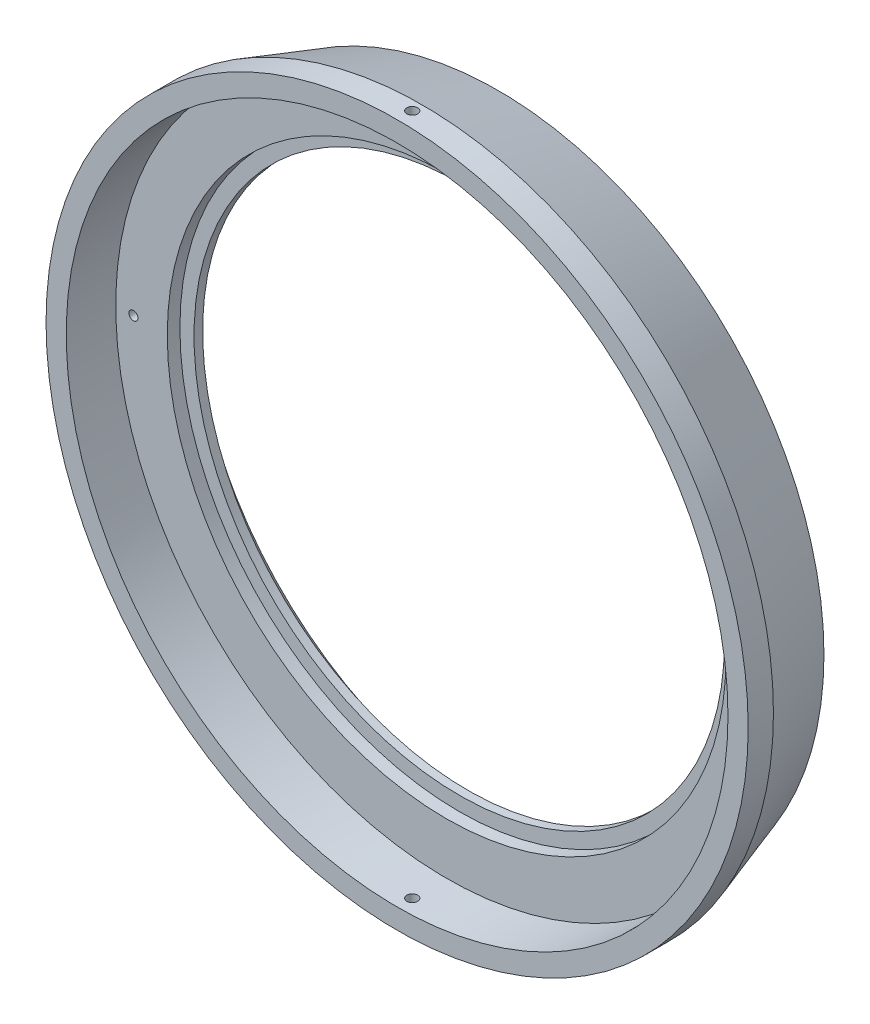
ISO-10303-21;
HEADER;
FILE_DESCRIPTION(('STEP AP214'),'2;1');
FILE_NAME('part.step','',(''),(''),'','','');
FILE_SCHEMA(('AUTOMOTIVE_DESIGN { 1 0 10303 214 1 1 1 1 }'));
ENDSEC;
DATA;
#1=APPLICATION_CONTEXT('core data for automotive mechanical design processes');
#2=APPLICATION_PROTOCOL_DEFINITION('international standard','automotive_design',2000,#1);
#3=PRODUCT_CONTEXT('',#1,'mechanical');
#4=PRODUCT('Part','Part','',(#3));
#5=PRODUCT_RELATED_PRODUCT_CATEGORY('part','',(#4));
#6=PRODUCT_DEFINITION_FORMATION('','',#4);
#7=PRODUCT_DEFINITION_CONTEXT('part definition',#1,'design');
#8=PRODUCT_DEFINITION('design','',#6,#7);
#9=PRODUCT_DEFINITION_SHAPE('','',#8);
#10=(LENGTH_UNIT() NAMED_UNIT(*) SI_UNIT(.MILLI.,.METRE.));
#11=(NAMED_UNIT(*) PLANE_ANGLE_UNIT() SI_UNIT($,.RADIAN.));
#12=(NAMED_UNIT(*) SI_UNIT($,.STERADIAN.) SOLID_ANGLE_UNIT());
#13=UNCERTAINTY_MEASURE_WITH_UNIT(LENGTH_MEASURE(1.E-05),#10,'distance_accuracy_value','');
#14=(GEOMETRIC_REPRESENTATION_CONTEXT(3) GLOBAL_UNCERTAINTY_ASSIGNED_CONTEXT((#13)) GLOBAL_UNIT_ASSIGNED_CONTEXT((#10,
#11,#12)) REPRESENTATION_CONTEXT('',''));
#15=CARTESIAN_POINT('',(0.,0.,0.));
#16=DIRECTION('',(0.,0.,1.));
#17=DIRECTION('',(1.,0.,0.));
#18=AXIS2_PLACEMENT_3D('',#15,#16,#17);
#19=CARTESIAN_POINT('',(0.,0.,25.4));
#20=DIRECTION('',(0.,0.,-1.));
#21=DIRECTION('',(-1.,0.,0.));
#22=AXIS2_PLACEMENT_3D('',#19,#20,#21);
#23=CYLINDRICAL_SURFACE('',#22,88.265);
#24=CARTESIAN_POINT('',(0.,-88.265,22.94255));
#25=CARTESIAN_POINT('',(0.0759685424256277,-88.264999859988,22.9425466326268));
#26=CARTESIAN_POINT('',(0.151992055687485,-88.2649008694297,22.936128145498));
#27=CARTESIAN_POINT('',(0.301945026810555,-88.2645154927316,22.9106127790071));
#28=CARTESIAN_POINT('',(0.375871857780507,-88.2642288814856,22.8915006695043));
#29=CARTESIAN_POINT('',(0.519437343409552,-88.263500729006,22.841142558233));
#30=CARTESIAN_POINT('',(0.589078040606503,-88.2630592622508,22.8099023887267));
#31=CARTESIAN_POINT('',(0.722106798009332,-88.2620712271952,22.736183055391));
#32=CARTESIAN_POINT('',(0.785496400246483,-88.2615246849136,22.6937066728994));
#33=CARTESIAN_POINT('',(0.904257603167196,-88.2603879248538,22.5987083947465));
#34=CARTESIAN_POINT('',(0.95962777485974,-88.2597976993198,22.5461847126063));
#35=CARTESIAN_POINT('',(1.06076666124008,-88.2586401657667,22.4325849593066));
#36=CARTESIAN_POINT('',(1.10653499748662,-88.2580728586517,22.3715085512129));
#37=CARTESIAN_POINT('',(1.18716976909093,-88.2570251314188,22.2425362367148));
#38=CARTESIAN_POINT('',(1.2220358713234,-88.2565447139561,22.1746401220132));
#39=CARTESIAN_POINT('',(1.27987406632831,-88.2557249634532,22.0339573084132));
#40=CARTESIAN_POINT('',(1.30284618921664,-88.2553856300558,21.9611706218984));
#41=CARTESIAN_POINT('',(1.33624269833971,-88.2548863368842,21.812778747671));
#42=CARTESIAN_POINT('',(1.3466680595793,-88.2547263631722,21.737173779437));
#43=CARTESIAN_POINT('',(1.35467809210785,-88.2546037839277,21.5852866668808));
#44=CARTESIAN_POINT('',(1.35226279386922,-88.2546411779268,21.509004524166));
#45=CARTESIAN_POINT('',(1.33466094834983,-88.2549091042145,21.3579350766472));
#46=CARTESIAN_POINT('',(1.31947546983167,-88.2551396203402,21.2831476472837));
#47=CARTESIAN_POINT('',(1.27676596791952,-88.2557677774888,21.1371837362106));
#48=CARTESIAN_POINT('',(1.2492419278061,-88.2561654187381,21.0660072593941));
#49=CARTESIAN_POINT('',(1.1826353964172,-88.2570830151386,20.9292823583018));
#50=CARTESIAN_POINT('',(1.14355241527837,-88.2576029754735,20.8637341727028));
#51=CARTESIAN_POINT('',(1.05493782373318,-88.2587065845068,20.7401291964904));
#52=CARTESIAN_POINT('',(1.00540621022067,-88.2592902332242,20.6820724081041));
#53=CARTESIAN_POINT('',(0.897294317351466,-88.2604554914424,20.5750920002664));
#54=CARTESIAN_POINT('',(0.838713107003588,-88.261037100727,20.5261693216456));
#55=CARTESIAN_POINT('',(0.714168240935099,-88.2621326519208,20.438853132368));
#56=CARTESIAN_POINT('',(0.648204584197212,-88.2626465938207,20.4004596231622));
#57=CARTESIAN_POINT('',(0.510766823404227,-88.263548870978,20.3352917629766));
#58=CARTESIAN_POINT('',(0.439292706137229,-88.2639372059342,20.308517439856));
#59=CARTESIAN_POINT('',(0.292863183973475,-88.2645444839995,20.2673485846012));
#60=CARTESIAN_POINT('',(0.217907781664492,-88.2647634272344,20.2529540432647));
#61=CARTESIAN_POINT('',(0.0666516081899811,-88.2650072233672,20.2369545152216));
#62=CARTESIAN_POINT('',(-0.00964902535308479,-88.2650320960051,20.2353482277483));
#63=CARTESIAN_POINT('',(-0.161436899437708,-88.2648849991048,20.2449674173061));
#64=CARTESIAN_POINT('',(-0.236924140197854,-88.2647130296196,20.2561928908888));
#65=CARTESIAN_POINT('',(-0.384938762063575,-88.2641916475764,20.2911558711378));
#66=CARTESIAN_POINT('',(-0.457466282293365,-88.2638422433693,20.3148927889612));
#67=CARTESIAN_POINT('',(-0.597506892359322,-88.2630053793142,20.3742042400736));
#68=CARTESIAN_POINT('',(-0.665019980042248,-88.2625179194067,20.4097787784456));
#69=CARTESIAN_POINT('',(-0.793121234108174,-88.2614598405584,20.4917589748552));
#70=CARTESIAN_POINT('',(-0.853708839940509,-88.2608892148945,20.5381655087144));
#71=CARTESIAN_POINT('',(-0.96623362866124,-88.2597291542212,20.6404910872243));
#72=CARTESIAN_POINT('',(-1.01817080320656,-88.2591397191936,20.6964101410495));
#73=CARTESIAN_POINT('',(-1.11192471376652,-88.2580084367001,20.8161789621977));
#74=CARTESIAN_POINT('',(-1.15374060910162,-88.2574665931896,20.8800293876391));
#75=CARTESIAN_POINT('',(-1.22605916398515,-88.256491645378,21.0138450158439));
#76=CARTESIAN_POINT('',(-1.25656183902144,-88.256058540928,21.0838102102359));
#77=CARTESIAN_POINT('',(-1.30538664472826,-88.2553499287974,21.2278661308531));
#78=CARTESIAN_POINT('',(-1.32370932440448,-88.2550744140137,21.3019566709676));
#79=CARTESIAN_POINT('',(-1.34765583498588,-88.2547120234361,21.4521628350023));
#80=CARTESIAN_POINT('',(-1.35327965188023,-88.2546251478504,21.5282784611567));
#81=CARTESIAN_POINT('',(-1.3516686900966,-88.2546498335717,21.680365513743));
#82=CARTESIAN_POINT('',(-1.34443525188035,-88.2547613741923,21.7563369543806));
#83=CARTESIAN_POINT('',(-1.31731783571436,-88.2551702741662,21.9059871178779));
#84=CARTESIAN_POINT('',(-1.29743383240739,-88.255467633892,21.9796658361416));
#85=CARTESIAN_POINT('',(-1.2455795671077,-88.2562146504535,22.12264043614));
#86=CARTESIAN_POINT('',(-1.2136090832734,-88.2566643100847,22.1919362374011));
#87=CARTESIAN_POINT('',(-1.13849085649738,-88.2576652098828,22.3241744927953));
#88=CARTESIAN_POINT('',(-1.09534354337347,-88.2582164461432,22.3871171911149));
#89=CARTESIAN_POINT('',(-0.999096374489048,-88.2593583769619,22.504866290249));
#90=CARTESIAN_POINT('',(-0.945996540319697,-88.2599490714346,22.5596727087139));
#91=CARTESIAN_POINT('',(-0.831333921919023,-88.2611034872464,22.6596071734711));
#92=CARTESIAN_POINT('',(-0.769769039586007,-88.2616672018515,22.7047328132159));
#93=CARTESIAN_POINT('',(-0.639909747931443,-88.2627042195314,22.7840269686425));
#94=CARTESIAN_POINT('',(-0.571611843815412,-88.2631774752748,22.818189754462));
#95=CARTESIAN_POINT('',(-0.430302558045668,-88.2639792671995,22.8745246273715));
#96=CARTESIAN_POINT('',(-0.357296937134505,-88.2643079765459,22.8967110692934));
#97=CARTESIAN_POINT('',(-0.236522591380123,-88.2646954089289,22.9225590327191));
#98=CARTESIAN_POINT('',(-0.18953841680852,-88.2648091376093,22.9300462695273));
#99=CARTESIAN_POINT('',(-0.0950433348390116,-88.2649614769438,22.9400428064383));
#100=CARTESIAN_POINT('',(-0.0475324274808863,-88.2650000876035,22.9425521069171));
#101=CARTESIAN_POINT('',(0.,-88.265,22.94255));
#102=B_SPLINE_CURVE_WITH_KNOTS('',3,(#24,#25,#26,#27,#28,#29,#30,#31,#32,#33,#34,#35,#36,#37,
#38,#39,#40,#41,#42,#43,#44,#45,#46,#47,#48,#49,#50,#51,#52,#53,#54,#55,#56,#57,#58,#59,#60,#61,
#62,#63,#64,#65,#66,#67,#68,#69,#70,#71,#72,#73,#74,#75,#76,#77,#78,#79,#80,#81,#82,#83,#84,#85,
#86,#87,#88,#89,#90,#91,#92,#93,#94,#95,#96,#97,#98,#99,#100,#101),.UNSPECIFIED.,.T.,.F.,(4,2,2,
2,2,2,2,2,2,2,2,2,2,2,2,2,2,2,2,2,2,2,2,2,2,2,2,2,2,2,2,2,2,2,2,2,2,2,4),(0.,0.227732132408335,
0.45573799859902,0.683634354609526,0.911474351368111,1.1393548973641,1.36724442322685,
1.59514091173121,1.82303682319257,2.05091502379153,2.27879268360878,2.50665127377486,
2.73451017270323,2.96237872958591,3.19024735420891,3.4181394367977,3.64603155078926,
3.87392421119277,4.10181670219768,4.32968601265164,4.55755526186684,4.78541378752438,
5.0132724110258,5.2411494644353,5.46902673762386,5.69692293194536,5.92481881427428,
6.15270442364159,6.38059028443786,6.60845238788032,6.83631494805892,7.06418169074904,
7.29203967186277,7.51989715866358,7.74781122315226,7.9758442162736,8.20360327897999,
8.34609201893277,8.48858074812438),.UNSPECIFIED.);
#103=CARTESIAN_POINT('',(0.,-88.265,22.94255));
#104=VERTEX_POINT('',#103);
#105=EDGE_CURVE('E96',#104,#104,#102,.T.);
#106=ORIENTED_EDGE('',*,*,#105,.T.);
#107=EDGE_LOOP('',(#106));
#108=FACE_BOUND('',#107,.T.);
#109=CARTESIAN_POINT('',(0.,88.265,22.94255));
#110=CARTESIAN_POINT('',(-0.0759685424256277,88.264999859988,22.9425466326268));
#111=CARTESIAN_POINT('',(-0.151992055687485,88.2649008694297,22.936128145498));
#112=CARTESIAN_POINT('',(-0.301945026810555,88.2645154927316,22.9106127790071));
#113=CARTESIAN_POINT('',(-0.375871857780507,88.2642288814856,22.8915006695043));
#114=CARTESIAN_POINT('',(-0.519437343409552,88.263500729006,22.841142558233));
#115=CARTESIAN_POINT('',(-0.589078040606503,88.2630592622508,22.8099023887267));
#116=CARTESIAN_POINT('',(-0.722106798009332,88.2620712271952,22.736183055391));
#117=CARTESIAN_POINT('',(-0.785496400246483,88.2615246849136,22.6937066728994));
#118=CARTESIAN_POINT('',(-0.904257603167196,88.2603879248538,22.5987083947465));
#119=CARTESIAN_POINT('',(-0.95962777485974,88.2597976993198,22.5461847126063));
#120=CARTESIAN_POINT('',(-1.06076666124008,88.2586401657667,22.4325849593066));
#121=CARTESIAN_POINT('',(-1.10653499748662,88.2580728586517,22.3715085512129));
#122=CARTESIAN_POINT('',(-1.18716976909093,88.2570251314188,22.2425362367148));
#123=CARTESIAN_POINT('',(-1.2220358713234,88.2565447139561,22.1746401220132));
#124=CARTESIAN_POINT('',(-1.27987406632831,88.2557249634532,22.0339573084132));
#125=CARTESIAN_POINT('',(-1.30284618921664,88.2553856300558,21.9611706218984));
#126=CARTESIAN_POINT('',(-1.33624269833971,88.2548863368842,21.812778747671));
#127=CARTESIAN_POINT('',(-1.3466680595793,88.2547263631722,21.737173779437));
#128=CARTESIAN_POINT('',(-1.35467809210785,88.2546037839277,21.5852866668808));
#129=CARTESIAN_POINT('',(-1.35226279386922,88.2546411779268,21.509004524166));
#130=CARTESIAN_POINT('',(-1.33466094834983,88.2549091042145,21.3579350766472));
#131=CARTESIAN_POINT('',(-1.31947546983167,88.2551396203402,21.2831476472837));
#132=CARTESIAN_POINT('',(-1.27676596791952,88.2557677774888,21.1371837362106));
#133=CARTESIAN_POINT('',(-1.2492419278061,88.2561654187381,21.0660072593941));
#134=CARTESIAN_POINT('',(-1.1826353964172,88.2570830151386,20.9292823583018));
#135=CARTESIAN_POINT('',(-1.14355241527837,88.2576029754735,20.8637341727028));
#136=CARTESIAN_POINT('',(-1.05493782373318,88.2587065845068,20.7401291964904));
#137=CARTESIAN_POINT('',(-1.00540621022067,88.2592902332242,20.6820724081041));
#138=CARTESIAN_POINT('',(-0.897294317351466,88.2604554914424,20.5750920002664));
#139=CARTESIAN_POINT('',(-0.838713107003588,88.261037100727,20.5261693216456));
#140=CARTESIAN_POINT('',(-0.714168240935099,88.2621326519208,20.438853132368));
#141=CARTESIAN_POINT('',(-0.648204584197212,88.2626465938207,20.4004596231622));
#142=CARTESIAN_POINT('',(-0.510766823404227,88.263548870978,20.3352917629766));
#143=CARTESIAN_POINT('',(-0.439292706137229,88.2639372059342,20.308517439856));
#144=CARTESIAN_POINT('',(-0.292863183973475,88.2645444839995,20.2673485846012));
#145=CARTESIAN_POINT('',(-0.217907781664492,88.2647634272344,20.2529540432647));
#146=CARTESIAN_POINT('',(-0.0666516081899811,88.2650072233672,20.2369545152216));
#147=CARTESIAN_POINT('',(0.00964902535308479,88.2650320960051,20.2353482277483));
#148=CARTESIAN_POINT('',(0.161436899437708,88.2648849991048,20.2449674173061));
#149=CARTESIAN_POINT('',(0.236924140197854,88.2647130296196,20.2561928908888));
#150=CARTESIAN_POINT('',(0.384938762063575,88.2641916475764,20.2911558711378));
#151=CARTESIAN_POINT('',(0.457466282293365,88.2638422433693,20.3148927889612));
#152=CARTESIAN_POINT('',(0.597506892359322,88.2630053793142,20.3742042400736));
#153=CARTESIAN_POINT('',(0.665019980042248,88.2625179194067,20.4097787784456));
#154=CARTESIAN_POINT('',(0.793121234108174,88.2614598405584,20.4917589748552));
#155=CARTESIAN_POINT('',(0.853708839940509,88.2608892148945,20.5381655087144));
#156=CARTESIAN_POINT('',(0.96623362866124,88.2597291542212,20.6404910872243));
#157=CARTESIAN_POINT('',(1.01817080320656,88.2591397191936,20.6964101410495));
#158=CARTESIAN_POINT('',(1.11192471376652,88.2580084367001,20.8161789621977));
#159=CARTESIAN_POINT('',(1.15374060910162,88.2574665931896,20.8800293876391));
#160=CARTESIAN_POINT('',(1.22605916398515,88.256491645378,21.0138450158439));
#161=CARTESIAN_POINT('',(1.25656183902144,88.256058540928,21.0838102102359));
#162=CARTESIAN_POINT('',(1.30538664472826,88.2553499287974,21.2278661308531));
#163=CARTESIAN_POINT('',(1.32370932440448,88.2550744140137,21.3019566709676));
#164=CARTESIAN_POINT('',(1.34765583498588,88.2547120234361,21.4521628350023));
#165=CARTESIAN_POINT('',(1.35327965188023,88.2546251478504,21.5282784611567));
#166=CARTESIAN_POINT('',(1.3516686900966,88.2546498335717,21.680365513743));
#167=CARTESIAN_POINT('',(1.34443525188035,88.2547613741923,21.7563369543806));
#168=CARTESIAN_POINT('',(1.31731783571436,88.2551702741662,21.9059871178779));
#169=CARTESIAN_POINT('',(1.29743383240739,88.255467633892,21.9796658361416));
#170=CARTESIAN_POINT('',(1.2455795671077,88.2562146504535,22.12264043614));
#171=CARTESIAN_POINT('',(1.2136090832734,88.2566643100847,22.1919362374011));
#172=CARTESIAN_POINT('',(1.13849085649738,88.2576652098828,22.3241744927953));
#173=CARTESIAN_POINT('',(1.09534354337347,88.2582164461432,22.3871171911149));
#174=CARTESIAN_POINT('',(0.999096374489048,88.2593583769619,22.504866290249));
#175=CARTESIAN_POINT('',(0.945996540319697,88.2599490714346,22.5596727087139));
#176=CARTESIAN_POINT('',(0.831333921919023,88.2611034872464,22.6596071734711));
#177=CARTESIAN_POINT('',(0.769769039586007,88.2616672018515,22.7047328132159));
#178=CARTESIAN_POINT('',(0.639909747931443,88.2627042195314,22.7840269686425));
#179=CARTESIAN_POINT('',(0.571611843815412,88.2631774752748,22.818189754462));
#180=CARTESIAN_POINT('',(0.430302558045668,88.2639792671995,22.8745246273715));
#181=CARTESIAN_POINT('',(0.357296937134505,88.2643079765459,22.8967110692934));
#182=CARTESIAN_POINT('',(0.236522591380123,88.2646954089289,22.9225590327191));
#183=CARTESIAN_POINT('',(0.18953841680852,88.2648091376093,22.9300462695273));
#184=CARTESIAN_POINT('',(0.0950433348390116,88.2649614769438,22.9400428064383));
#185=CARTESIAN_POINT('',(0.0475324274808863,88.2650000876035,22.9425521069171));
#186=CARTESIAN_POINT('',(0.,88.265,22.94255));
#187=B_SPLINE_CURVE_WITH_KNOTS('',3,(#109,#110,#111,#112,#113,#114,#115,#116,#117,#118,#119,
#120,#121,#122,#123,#124,#125,#126,#127,#128,#129,#130,#131,#132,#133,#134,#135,#136,#137,#138,
#139,#140,#141,#142,#143,#144,#145,#146,#147,#148,#149,#150,#151,#152,#153,#154,#155,#156,#157,
#158,#159,#160,#161,#162,#163,#164,#165,#166,#167,#168,#169,#170,#171,#172,#173,#174,#175,#176,
#177,#178,#179,#180,#181,#182,#183,#184,#185,#186),.UNSPECIFIED.,.T.,.F.,(4,2,2,2,2,2,2,2,2,2,2,
2,2,2,2,2,2,2,2,2,2,2,2,2,2,2,2,2,2,2,2,2,2,2,2,2,2,2,4),(0.,0.227732132408335,0.45573799859902,
0.683634354609526,0.911474351368111,1.1393548973641,1.36724442322685,1.59514091173121,
1.82303682319257,2.05091502379153,2.27879268360878,2.50665127377486,2.73451017270323,
2.96237872958591,3.19024735420891,3.4181394367977,3.64603155078926,3.87392421119277,
4.10181670219768,4.32968601265164,4.55755526186684,4.78541378752438,5.0132724110258,
5.2411494644353,5.46902673762386,5.69692293194536,5.92481881427428,6.15270442364159,
6.38059028443786,6.60845238788032,6.83631494805892,7.06418169074904,7.29203967186277,
7.51989715866358,7.74781122315226,7.9758442162736,8.20360327897999,8.34609201893277,
8.48858074812438),.UNSPECIFIED.);
#188=CARTESIAN_POINT('',(0.,88.265,22.94255));
#189=VERTEX_POINT('',#188);
#190=EDGE_CURVE('E88',#189,#189,#187,.T.);
#191=ORIENTED_EDGE('',*,*,#190,.T.);
#192=EDGE_LOOP('',(#191));
#193=FACE_BOUND('',#192,.T.);
#194=CARTESIAN_POINT('',(0.,0.,19.0500000000003));
#195=DIRECTION('',(0.,0.,1.));
#196=DIRECTION('',(1.,0.,0.));
#197=AXIS2_PLACEMENT_3D('',#194,#195,#196);
#198=CIRCLE('',#197,88.265);
#199=CARTESIAN_POINT('',(88.265,0.,19.0500000000003));
#200=VERTEX_POINT('',#199);
#201=EDGE_CURVE('E154',#200,#200,#198,.T.);
#202=ORIENTED_EDGE('',*,*,#201,.T.);
#203=EDGE_LOOP('',(#202));
#204=FACE_BOUND('',#203,.T.);
#205=CARTESIAN_POINT('',(0.,0.,25.4));
#206=DIRECTION('',(0.,0.,1.));
#207=DIRECTION('',(1.,0.,0.));
#208=AXIS2_PLACEMENT_3D('',#205,#206,#207);
#209=CIRCLE('',#208,88.265);
#210=CARTESIAN_POINT('',(88.265,0.,25.4));
#211=VERTEX_POINT('',#210);
#212=EDGE_CURVE('E157',#211,#211,#209,.T.);
#213=ORIENTED_EDGE('',*,*,#212,.F.);
#214=EDGE_LOOP('',(#213));
#215=FACE_BOUND('',#214,.T.);
#216=ADVANCED_FACE('F38',(#108,#193,#204,#215),#23,.T.);
#217=CARTESIAN_POINT('',(0.,0.,25.4));
#218=DIRECTION('',(0.,0.,1.));
#219=DIRECTION('',(1.,0.,0.));
#220=AXIS2_PLACEMENT_3D('',#217,#218,#219);
#221=PLANE('',#220);
#222=CARTESIAN_POINT('',(0.,0.,25.4));
#223=DIRECTION('',(0.,0.,1.));
#224=DIRECTION('',(1.,0.,0.));
#225=AXIS2_PLACEMENT_3D('',#222,#223,#224);
#226=CIRCLE('',#225,83.185);
#227=CARTESIAN_POINT('',(83.185,0.,25.4));
#228=VERTEX_POINT('',#227);
#229=EDGE_CURVE('E160',#228,#228,#226,.T.);
#230=ORIENTED_EDGE('',*,*,#229,.F.);
#231=EDGE_LOOP('',(#230));
#232=FACE_BOUND('',#231,.T.);
#233=ORIENTED_EDGE('',*,*,#212,.T.);
#234=EDGE_LOOP('',(#233));
#235=FACE_BOUND('',#234,.T.);
#236=ADVANCED_FACE('F132',(#232,#235),#221,.T.);
#237=CARTESIAN_POINT('',(0.,0.,0.));
#238=DIRECTION('',(0.,0.,1.));
#239=DIRECTION('',(1.,0.,0.));
#240=AXIS2_PLACEMENT_3D('',#237,#238,#239);
#241=PLANE('',#240);
#242=CARTESIAN_POINT('',(0.,0.,0.));
#243=DIRECTION('',(0.,0.,1.));
#244=DIRECTION('',(1.,0.,0.));
#245=AXIS2_PLACEMENT_3D('',#242,#243,#244);
#246=CIRCLE('',#245,76.8350000000001);
#247=CARTESIAN_POINT('',(76.8350000000001,0.,0.));
#248=VERTEX_POINT('',#247);
#249=EDGE_CURVE('E54',#248,#248,#246,.T.);
#250=ORIENTED_EDGE('',*,*,#249,.T.);
#251=EDGE_LOOP('',(#250));
#252=FACE_BOUND('',#251,.T.);
#253=CARTESIAN_POINT('',(0.,0.,0.));
#254=DIRECTION('',(0.,0.,1.));
#255=DIRECTION('',(1.,0.,0.));
#256=AXIS2_PLACEMENT_3D('',#253,#254,#255);
#257=CIRCLE('',#256,81.915);
#258=CARTESIAN_POINT('',(81.915,0.,0.));
#259=VERTEX_POINT('',#258);
#260=EDGE_CURVE('E165',#259,#259,#257,.F.);
#261=ORIENTED_EDGE('',*,*,#260,.T.);
#262=EDGE_LOOP('',(#261));
#263=FACE_BOUND('',#262,.T.);
#264=ADVANCED_FACE('F129',(#252,#263),#241,.F.);
#265=CARTESIAN_POINT('',(0.,0.,16.256));
#266=DIRECTION('',(0.,0.,1.));
#267=DIRECTION('',(1.,0.,0.));
#268=AXIS2_PLACEMENT_3D('',#265,#266,#267);
#269=CYLINDRICAL_SURFACE('',#268,83.185);
#270=CARTESIAN_POINT('',(0.,-83.185,22.94255));
#271=CARTESIAN_POINT('',(-0.0759679402365513,-83.1849998514561,22.942546632832));
#272=CARTESIAN_POINT('',(-0.151990836585921,-83.1848948173557,22.9361282470618));
#273=CARTESIAN_POINT('',(-0.301942549575889,-83.1844859127567,22.9106133066354));
#274=CARTESIAN_POINT('',(-0.375868739981549,-83.1841818034685,22.8915015259146));
#275=CARTESIAN_POINT('',(-0.519432941235495,-83.1834091958008,22.8411443393518));
#276=CARTESIAN_POINT('',(-0.589072996221252,-83.1829407765093,22.809904770248));
#277=CARTESIAN_POINT('',(-0.722100596594091,-83.1818924179085,22.7361869057834));
#278=CARTESIAN_POINT('',(-0.785489683053397,-83.1813125061904,22.6937113900151));
#279=CARTESIAN_POINT('',(-0.904250635079579,-83.180106331411,22.5987146246324));
#280=CARTESIAN_POINT('',(-0.959620997600609,-83.1794800596931,22.5461914959443));
#281=CARTESIAN_POINT('',(-1.06076040387543,-83.1782518285495,22.4325928164697));
#282=CARTESIAN_POINT('',(-1.1065290690193,-83.1776498700831,22.3715169285929));
#283=CARTESIAN_POINT('',(-1.18716489664341,-83.1765381384919,22.2425451348785));
#284=CARTESIAN_POINT('',(-1.22203165847252,-83.1760283687553,22.1746489785132));
#285=CARTESIAN_POINT('',(-1.27987112232967,-83.1751585295714,22.0339658597107));
#286=CARTESIAN_POINT('',(-1.3028438552544,-83.1747984597352,21.9611789099786));
#287=CARTESIAN_POINT('',(-1.33624129422572,-83.1742686538897,21.8127870687091));
#288=CARTESIAN_POINT('',(-1.34666710098743,-83.1740989011843,21.7371824249619));
#289=CARTESIAN_POINT('',(-1.35467810970136,-83.1739688184674,21.5852958635203));
#290=CARTESIAN_POINT('',(-1.35226334304903,-83.1740084879439,21.5090139474823));
#291=CARTESIAN_POINT('',(-1.33466273473965,-83.1742927605294,21.3579456996091));
#292=CARTESIAN_POINT('',(-1.31947809700034,-83.1745373443196,21.2831592274669));
#293=CARTESIAN_POINT('',(-1.27677063619395,-83.1752038413025,21.1371970893585));
#294=CARTESIAN_POINT('',(-1.24924779594324,-83.1756257547423,21.0660214284211));
#295=CARTESIAN_POINT('',(-1.18264383369648,-83.1765993674398,20.9292975547217));
#296=CARTESIAN_POINT('',(-1.14356215975022,-83.1771510728951,20.8637496108836));
#297=CARTESIAN_POINT('',(-1.05495035964809,-83.1783220643235,20.7401448367979));
#298=CARTESIAN_POINT('',(-1.00542022946301,-83.1789413503226,20.6820880094391));
#299=CARTESIAN_POINT('',(-0.897310673526377,-83.180177771862,20.5751064567418));
#300=CARTESIAN_POINT('',(-0.838730199738461,-83.1807949071448,20.5261827904809));
#301=CARTESIAN_POINT('',(-0.714186568351293,-83.1819573828864,20.4388644963928));
#302=CARTESIAN_POINT('',(-0.648223409727725,-83.1825027233353,20.4004698700264));
#303=CARTESIAN_POINT('',(-0.510786325999999,-83.1834601309471,20.3352996902465));
#304=CARTESIAN_POINT('',(-0.439312385959411,-83.1838721977489,20.3085241683268));
#305=CARTESIAN_POINT('',(-0.292882921878569,-83.1845165966127,20.2673529388012));
#306=CARTESIAN_POINT('',(-0.217927400732344,-83.184748928824,20.252957220905));
#307=CARTESIAN_POINT('',(-0.0666717232481609,-83.1850076477216,20.2369555409734));
#308=CARTESIAN_POINT('',(0.00962827812331199,-83.1850340579891,20.235348114483));
#309=CARTESIAN_POINT('',(0.161415076283166,-83.1848780179959,20.2449648331139));
#310=CARTESIAN_POINT('',(0.236901873322216,-83.1846955677996,20.2561889742797));
#311=CARTESIAN_POINT('',(0.384915354548859,-83.1841423897182,20.2911489993413));
#312=CARTESIAN_POINT('',(0.457442195392439,-83.1837716718111,20.3148842201592));
#313=CARTESIAN_POINT('',(0.597481752430014,-83.1828837476739,20.3741919603894));
#314=CARTESIAN_POINT('',(0.664994466117939,-83.1823665413704,20.409764485718));
#315=CARTESIAN_POINT('',(0.793096043837049,-83.1812438788954,20.4917408193514));
#316=CARTESIAN_POINT('',(0.853684276730783,-83.180638414691,20.5381456138012));
#317=CARTESIAN_POINT('',(0.966210665248852,-83.1794075170294,20.6404677643396));
#318=CARTESIAN_POINT('',(1.01814881192045,-83.1787820835516,20.6963851302733));
#319=CARTESIAN_POINT('',(1.11190553196805,-83.1775816916085,20.816151376234));
#320=CARTESIAN_POINT('',(1.15372315923018,-83.1770067378656,20.8800009969619));
#321=CARTESIAN_POINT('',(1.22604527550538,-83.1759722021095,21.013815420871));
#322=CARTESIAN_POINT('',(1.25654978045181,-83.1755126199338,21.0837802154395));
#323=CARTESIAN_POINT('',(1.30537810527675,-83.1747606756274,21.2278353545172));
#324=CARTESIAN_POINT('',(1.32370254255359,-83.174468305021,21.3019254897098));
#325=CARTESIAN_POINT('',(1.34765260165793,-83.174083722649,21.4521312001013));
#326=CARTESIAN_POINT('',(1.35327821059208,-83.1739915110868,21.5282467773567));
#327=CARTESIAN_POINT('',(1.35167080998027,-83.1740176468113,21.6803330438831));
#328=CARTESIAN_POINT('',(1.34443930657942,-83.1741359694349,21.7563037490815));
#329=CARTESIAN_POINT('',(1.31732602392943,-83.1745697824669,21.9059527545564));
#330=CARTESIAN_POINT('',(1.2974442193345,-83.1748852732702,21.9796310502396));
#331=CARTESIAN_POINT('',(1.24559458986585,-83.1756778565694,22.122605158605));
#332=CARTESIAN_POINT('',(1.21362654370582,-83.1761549520241,22.1919008910199));
#333=CARTESIAN_POINT('',(1.13851337377378,-83.1772169339071,22.3241394596486));
#334=CARTESIAN_POINT('',(1.09536867867273,-83.1778018162011,22.3870825393845));
#335=CARTESIAN_POINT('',(0.999126193050168,-83.1790134671897,22.5048337092485));
#336=CARTESIAN_POINT('',(0.946028295776378,-83.1796402363335,22.5596417121133));
#337=CARTESIAN_POINT('',(0.831369261183422,-83.180865166605,22.6595796918544));
#338=CARTESIAN_POINT('',(0.769806025951268,-83.1814633205916,22.7047072625693));
#339=CARTESIAN_POINT('',(0.639949253995879,-83.1825637106419,22.7840058129397));
#340=CARTESIAN_POINT('',(0.571652184821809,-83.183065895952,22.8181710015141));
#341=CARTESIAN_POINT('',(0.430344028886012,-83.1839167167,22.8745107572924));
#342=CARTESIAN_POINT('',(0.357338702492617,-83.1842655358369,22.8966996767373));
#343=CARTESIAN_POINT('',(0.236557754576979,-83.1846767116142,22.9225530446308));
#344=CARTESIAN_POINT('',(0.189566698948049,-83.1847974214026,22.9300425216424));
#345=CARTESIAN_POINT('',(0.0950576025691415,-83.1849591120704,22.940042052676));
#346=CARTESIAN_POINT('',(0.0475395618640073,-83.1850000929565,22.9425521071217));
#347=CARTESIAN_POINT('',(0.,-83.185,22.94255));
#348=B_SPLINE_CURVE_WITH_KNOTS('',3,(#270,#271,#272,#273,#274,#275,#276,#277,#278,#279,#280,
#281,#282,#283,#284,#285,#286,#287,#288,#289,#290,#291,#292,#293,#294,#295,#296,#297,#298,#299,
#300,#301,#302,#303,#304,#305,#306,#307,#308,#309,#310,#311,#312,#313,#314,#315,#316,#317,#318,
#319,#320,#321,#322,#323,#324,#325,#326,#327,#328,#329,#330,#331,#332,#333,#334,#335,#336,#337,
#338,#339,#340,#341,#342,#343,#344,#345,#346,#347),.UNSPECIFIED.,.T.,.F.,(4,2,2,2,2,2,2,2,2,2,2,
2,2,2,2,2,2,2,2,2,2,2,2,2,2,2,2,2,2,2,2,2,2,2,2,2,2,2,4),(0.,0.227730299594072,
0.455734262287972,0.683628629323352,0.911466671594878,1.13934736516771,1.36723704274387,
1.59513509441083,1.82303255407205,2.05091001931655,2.27878692739642,2.50664235410813,
2.73449809815928,2.96236472439279,3.19023143849785,3.41812455953976,3.64601771220092,
3.87391148256573,4.10180506349946,4.32967254675738,4.55753995977337,4.78539529720212,
5.0132507485126,5.24112695135912,5.46900339005334,5.69690112348965,5.92479853595475,
6.15268439559309,6.38057048660815,6.60842988368971,6.83628973730582,7.06415376299724,
7.29200905044937,7.51986678188503,7.74778108402504,7.97581558863612,8.20357620878044,
8.34608631966943,8.4885964184315),.UNSPECIFIED.);
#349=CARTESIAN_POINT('',(0.,-83.185,22.94255));
#350=VERTEX_POINT('',#349);
#351=EDGE_CURVE('E43',#350,#350,#348,.T.);
#352=ORIENTED_EDGE('',*,*,#351,.T.);
#353=EDGE_LOOP('',(#352));
#354=FACE_BOUND('',#353,.T.);
#355=CARTESIAN_POINT('',(0.,83.185,22.94255));
#356=CARTESIAN_POINT('',(0.0759679402365513,83.1849998514561,22.942546632832));
#357=CARTESIAN_POINT('',(0.151990836585921,83.1848948173557,22.9361282470618));
#358=CARTESIAN_POINT('',(0.301942549575889,83.1844859127567,22.9106133066354));
#359=CARTESIAN_POINT('',(0.375868739981549,83.1841818034685,22.8915015259146));
#360=CARTESIAN_POINT('',(0.519432941235495,83.1834091958008,22.8411443393518));
#361=CARTESIAN_POINT('',(0.589072996221252,83.1829407765093,22.809904770248));
#362=CARTESIAN_POINT('',(0.722100596594091,83.1818924179085,22.7361869057834));
#363=CARTESIAN_POINT('',(0.785489683053397,83.1813125061904,22.6937113900151));
#364=CARTESIAN_POINT('',(0.904250635079579,83.180106331411,22.5987146246324));
#365=CARTESIAN_POINT('',(0.959620997600609,83.1794800596931,22.5461914959443));
#366=CARTESIAN_POINT('',(1.06076040387543,83.1782518285495,22.4325928164697));
#367=CARTESIAN_POINT('',(1.1065290690193,83.1776498700831,22.3715169285929));
#368=CARTESIAN_POINT('',(1.18716489664341,83.1765381384919,22.2425451348785));
#369=CARTESIAN_POINT('',(1.22203165847252,83.1760283687553,22.1746489785132));
#370=CARTESIAN_POINT('',(1.27987112232967,83.1751585295714,22.0339658597107));
#371=CARTESIAN_POINT('',(1.3028438552544,83.1747984597352,21.9611789099786));
#372=CARTESIAN_POINT('',(1.33624129422572,83.1742686538897,21.8127870687091));
#373=CARTESIAN_POINT('',(1.34666710098743,83.1740989011843,21.7371824249619));
#374=CARTESIAN_POINT('',(1.35467810970136,83.1739688184674,21.5852958635203));
#375=CARTESIAN_POINT('',(1.35226334304903,83.1740084879439,21.5090139474823));
#376=CARTESIAN_POINT('',(1.33466273473965,83.1742927605294,21.3579456996091));
#377=CARTESIAN_POINT('',(1.31947809700034,83.1745373443196,21.2831592274669));
#378=CARTESIAN_POINT('',(1.27677063619395,83.1752038413025,21.1371970893585));
#379=CARTESIAN_POINT('',(1.24924779594324,83.1756257547423,21.0660214284211));
#380=CARTESIAN_POINT('',(1.18264383369648,83.1765993674398,20.9292975547217));
#381=CARTESIAN_POINT('',(1.14356215975022,83.1771510728951,20.8637496108836));
#382=CARTESIAN_POINT('',(1.05495035964809,83.1783220643235,20.7401448367979));
#383=CARTESIAN_POINT('',(1.00542022946301,83.1789413503226,20.6820880094391));
#384=CARTESIAN_POINT('',(0.897310673526377,83.180177771862,20.5751064567418));
#385=CARTESIAN_POINT('',(0.838730199738461,83.1807949071448,20.5261827904809));
#386=CARTESIAN_POINT('',(0.714186568351293,83.1819573828864,20.4388644963928));
#387=CARTESIAN_POINT('',(0.648223409727725,83.1825027233353,20.4004698700264));
#388=CARTESIAN_POINT('',(0.510786325999999,83.1834601309471,20.3352996902465));
#389=CARTESIAN_POINT('',(0.439312385959411,83.1838721977489,20.3085241683268));
#390=CARTESIAN_POINT('',(0.292882921878569,83.1845165966127,20.2673529388012));
#391=CARTESIAN_POINT('',(0.217927400732344,83.184748928824,20.252957220905));
#392=CARTESIAN_POINT('',(0.0666717232481609,83.1850076477216,20.2369555409734));
#393=CARTESIAN_POINT('',(-0.00962827812331199,83.1850340579891,20.235348114483));
#394=CARTESIAN_POINT('',(-0.161415076283166,83.1848780179959,20.2449648331139));
#395=CARTESIAN_POINT('',(-0.236901873322216,83.1846955677996,20.2561889742797));
#396=CARTESIAN_POINT('',(-0.384915354548859,83.1841423897182,20.2911489993413));
#397=CARTESIAN_POINT('',(-0.457442195392439,83.1837716718111,20.3148842201592));
#398=CARTESIAN_POINT('',(-0.597481752430014,83.1828837476739,20.3741919603894));
#399=CARTESIAN_POINT('',(-0.664994466117939,83.1823665413704,20.409764485718));
#400=CARTESIAN_POINT('',(-0.793096043837049,83.1812438788954,20.4917408193514));
#401=CARTESIAN_POINT('',(-0.853684276730783,83.180638414691,20.5381456138012));
#402=CARTESIAN_POINT('',(-0.966210665248852,83.1794075170294,20.6404677643396));
#403=CARTESIAN_POINT('',(-1.01814881192045,83.1787820835516,20.6963851302733));
#404=CARTESIAN_POINT('',(-1.11190553196805,83.1775816916085,20.816151376234));
#405=CARTESIAN_POINT('',(-1.15372315923018,83.1770067378656,20.8800009969619));
#406=CARTESIAN_POINT('',(-1.22604527550538,83.1759722021095,21.013815420871));
#407=CARTESIAN_POINT('',(-1.25654978045181,83.1755126199338,21.0837802154395));
#408=CARTESIAN_POINT('',(-1.30537810527675,83.1747606756274,21.2278353545172));
#409=CARTESIAN_POINT('',(-1.32370254255359,83.174468305021,21.3019254897098));
#410=CARTESIAN_POINT('',(-1.34765260165793,83.174083722649,21.4521312001013));
#411=CARTESIAN_POINT('',(-1.35327821059208,83.1739915110868,21.5282467773567));
#412=CARTESIAN_POINT('',(-1.35167080998027,83.1740176468113,21.6803330438831));
#413=CARTESIAN_POINT('',(-1.34443930657942,83.1741359694349,21.7563037490815));
#414=CARTESIAN_POINT('',(-1.31732602392943,83.1745697824669,21.9059527545564));
#415=CARTESIAN_POINT('',(-1.2974442193345,83.1748852732702,21.9796310502396));
#416=CARTESIAN_POINT('',(-1.24559458986585,83.1756778565694,22.122605158605));
#417=CARTESIAN_POINT('',(-1.21362654370582,83.1761549520241,22.1919008910199));
#418=CARTESIAN_POINT('',(-1.13851337377378,83.1772169339071,22.3241394596486));
#419=CARTESIAN_POINT('',(-1.09536867867273,83.1778018162011,22.3870825393845));
#420=CARTESIAN_POINT('',(-0.999126193050168,83.1790134671897,22.5048337092485));
#421=CARTESIAN_POINT('',(-0.946028295776378,83.1796402363335,22.5596417121133));
#422=CARTESIAN_POINT('',(-0.831369261183422,83.180865166605,22.6595796918544));
#423=CARTESIAN_POINT('',(-0.769806025951268,83.1814633205916,22.7047072625693));
#424=CARTESIAN_POINT('',(-0.639949253995879,83.1825637106419,22.7840058129397));
#425=CARTESIAN_POINT('',(-0.571652184821809,83.183065895952,22.8181710015141));
#426=CARTESIAN_POINT('',(-0.430344028886012,83.1839167167,22.8745107572924));
#427=CARTESIAN_POINT('',(-0.357338702492617,83.1842655358369,22.8966996767373));
#428=CARTESIAN_POINT('',(-0.236557754576979,83.1846767116142,22.9225530446308));
#429=CARTESIAN_POINT('',(-0.189566698948049,83.1847974214026,22.9300425216424));
#430=CARTESIAN_POINT('',(-0.0950576025691415,83.1849591120704,22.940042052676));
#431=CARTESIAN_POINT('',(-0.0475395618640073,83.1850000929565,22.9425521071217));
#432=CARTESIAN_POINT('',(0.,83.185,22.94255));
#433=B_SPLINE_CURVE_WITH_KNOTS('',3,(#355,#356,#357,#358,#359,#360,#361,#362,#363,#364,#365,
#366,#367,#368,#369,#370,#371,#372,#373,#374,#375,#376,#377,#378,#379,#380,#381,#382,#383,#384,
#385,#386,#387,#388,#389,#390,#391,#392,#393,#394,#395,#396,#397,#398,#399,#400,#401,#402,#403,
#404,#405,#406,#407,#408,#409,#410,#411,#412,#413,#414,#415,#416,#417,#418,#419,#420,#421,#422,
#423,#424,#425,#426,#427,#428,#429,#430,#431,#432),.UNSPECIFIED.,.T.,.F.,(4,2,2,2,2,2,2,2,2,2,2,
2,2,2,2,2,2,2,2,2,2,2,2,2,2,2,2,2,2,2,2,2,2,2,2,2,2,2,4),(0.,0.227730299594072,
0.455734262287972,0.683628629323352,0.911466671594878,1.13934736516771,1.36723704274387,
1.59513509441083,1.82303255407205,2.05091001931655,2.27878692739642,2.50664235410813,
2.73449809815928,2.96236472439279,3.19023143849785,3.41812455953976,3.64601771220092,
3.87391148256573,4.10180506349946,4.32967254675738,4.55753995977337,4.78539529720212,
5.0132507485126,5.24112695135912,5.46900339005334,5.69690112348965,5.92479853595475,
6.15268439559309,6.38057048660815,6.60842988368971,6.83628973730582,7.06415376299724,
7.29200905044937,7.51986678188503,7.74778108402504,7.97581558863612,8.20357620878044,
8.34608631966943,8.4885964184315),.UNSPECIFIED.);
#434=CARTESIAN_POINT('',(0.,83.185,22.94255));
#435=VERTEX_POINT('',#434);
#436=EDGE_CURVE('E87',#435,#435,#433,.T.);
#437=ORIENTED_EDGE('',*,*,#436,.T.);
#438=EDGE_LOOP('',(#437));
#439=FACE_BOUND('',#438,.T.);
#440=ORIENTED_EDGE('',*,*,#229,.T.);
#441=EDGE_LOOP('',(#440));
#442=FACE_BOUND('',#441,.T.);
#443=CARTESIAN_POINT('',(0.,0.,12.954));
#444=DIRECTION('',(0.,0.,1.));
#445=DIRECTION('',(1.,0.,0.));
#446=AXIS2_PLACEMENT_3D('',#443,#444,#445);
#447=CIRCLE('',#446,83.185);
#448=CARTESIAN_POINT('',(83.185,0.,12.954));
#449=VERTEX_POINT('',#448);
#450=EDGE_CURVE('E198',#449,#449,#447,.F.);
#451=ORIENTED_EDGE('',*,*,#450,.T.);
#452=EDGE_LOOP('',(#451));
#453=FACE_BOUND('',#452,.T.);
#454=ADVANCED_FACE('F123',(#354,#439,#442,#453),#269,.F.);
#455=CARTESIAN_POINT('',(0.,0.,12.954));
#456=DIRECTION('',(0.,0.,1.));
#457=DIRECTION('',(1.,0.,0.));
#458=AXIS2_PLACEMENT_3D('',#455,#456,#457);
#459=PLANE('',#458);
#460=CARTESIAN_POINT('',(-78.74,0.,12.954));
#461=DIRECTION('',(0.,0.,1.));
#462=DIRECTION('',(1.,0.,0.));
#463=AXIS2_PLACEMENT_3D('',#460,#461,#462);
#464=CIRCLE('',#463,1.1303);
#465=CARTESIAN_POINT('',(-77.6097,0.,12.954));
#466=VERTEX_POINT('',#465);
#467=EDGE_CURVE('E73',#466,#466,#464,.T.);
#468=ORIENTED_EDGE('',*,*,#467,.F.);
#469=EDGE_LOOP('',(#468));
#470=FACE_BOUND('',#469,.T.);
#471=CARTESIAN_POINT('',(78.74,0.,12.954));
#472=DIRECTION('',(0.,0.,1.));
#473=DIRECTION('',(1.,0.,0.));
#474=AXIS2_PLACEMENT_3D('',#471,#472,#473);
#475=CIRCLE('',#474,1.1303);
#476=CARTESIAN_POINT('',(79.8703,0.,12.954));
#477=VERTEX_POINT('',#476);
#478=EDGE_CURVE('E72',#477,#477,#475,.T.);
#479=ORIENTED_EDGE('',*,*,#478,.F.);
#480=EDGE_LOOP('',(#479));
#481=FACE_BOUND('',#480,.T.);
#482=CARTESIAN_POINT('',(0.,0.,12.954));
#483=DIRECTION('',(0.,0.,1.));
#484=DIRECTION('',(1.,0.,0.));
#485=AXIS2_PLACEMENT_3D('',#482,#483,#484);
#486=CIRCLE('',#485,70.231);
#487=CARTESIAN_POINT('',(70.231,0.,12.954));
#488=VERTEX_POINT('',#487);
#489=EDGE_CURVE('E197',#488,#488,#486,.T.);
#490=ORIENTED_EDGE('',*,*,#489,.F.);
#491=EDGE_LOOP('',(#490));
#492=FACE_BOUND('',#491,.T.);
#493=ORIENTED_EDGE('',*,*,#450,.F.);
#494=EDGE_LOOP('',(#493));
#495=FACE_BOUND('',#494,.T.);
#496=ADVANCED_FACE('F128',(#470,#481,#492,#495),#459,.T.);
#497=CARTESIAN_POINT('',(0.,0.,9.779));
#498=DIRECTION('',(0.,0.,1.));
#499=DIRECTION('',(1.,0.,0.));
#500=AXIS2_PLACEMENT_3D('',#497,#498,#499);
#501=CYLINDRICAL_SURFACE('',#500,70.231);
#502=CARTESIAN_POINT('',(0.,0.,9.779));
#503=DIRECTION('',(0.,0.,1.));
#504=DIRECTION('',(1.,0.,0.));
#505=AXIS2_PLACEMENT_3D('',#502,#503,#504);
#506=CIRCLE('',#505,70.231);
#507=CARTESIAN_POINT('',(70.231,0.,9.779));
#508=VERTEX_POINT('',#507);
#509=EDGE_CURVE('E168',#508,#508,#506,.T.);
#510=ORIENTED_EDGE('',*,*,#509,.F.);
#511=EDGE_LOOP('',(#510));
#512=FACE_BOUND('',#511,.T.);
#513=ORIENTED_EDGE('',*,*,#489,.T.);
#514=EDGE_LOOP('',(#513));
#515=FACE_BOUND('',#514,.T.);
#516=ADVANCED_FACE('F212',(#512,#515),#501,.F.);
#517=CARTESIAN_POINT('',(0.,0.,9.779));
#518=DIRECTION('',(0.,0.,1.));
#519=DIRECTION('',(1.,0.,0.));
#520=AXIS2_PLACEMENT_3D('',#517,#518,#519);
#521=PLANE('',#520);
#522=CARTESIAN_POINT('',(0.,0.,9.779));
#523=DIRECTION('',(0.,0.,1.));
#524=DIRECTION('',(1.,0.,0.));
#525=AXIS2_PLACEMENT_3D('',#522,#523,#524);
#526=CIRCLE('',#525,66.675);
#527=CARTESIAN_POINT('',(66.675,0.,9.779));
#528=VERTEX_POINT('',#527);
#529=EDGE_CURVE('E194',#528,#528,#526,.T.);
#530=ORIENTED_EDGE('',*,*,#529,.F.);
#531=EDGE_LOOP('',(#530));
#532=FACE_BOUND('',#531,.T.);
#533=ORIENTED_EDGE('',*,*,#509,.T.);
#534=EDGE_LOOP('',(#533));
#535=FACE_BOUND('',#534,.T.);
#536=ADVANCED_FACE('F191',(#532,#535),#521,.T.);
#537=CARTESIAN_POINT('',(0.,0.,0.));
#538=DIRECTION('',(0.,0.,1.));
#539=DIRECTION('',(1.,0.,0.));
#540=AXIS2_PLACEMENT_3D('',#537,#538,#539);
#541=CYLINDRICAL_SURFACE('',#540,66.675);
#542=CARTESIAN_POINT('',(0.,0.,7.62000000000004));
#543=DIRECTION('',(0.,0.,1.));
#544=DIRECTION('',(1.,0.,0.));
#545=AXIS2_PLACEMENT_3D('',#542,#543,#544);
#546=CIRCLE('',#545,66.675);
#547=CARTESIAN_POINT('',(66.675,0.,7.62000000000004));
#548=VERTEX_POINT('',#547);
#549=EDGE_CURVE('E11',#548,#548,#546,.F.);
#550=ORIENTED_EDGE('',*,*,#549,.T.);
#551=EDGE_LOOP('',(#550));
#552=FACE_BOUND('',#551,.T.);
#553=ORIENTED_EDGE('',*,*,#529,.T.);
#554=EDGE_LOOP('',(#553));
#555=FACE_BOUND('',#554,.T.);
#556=ADVANCED_FACE('F112',(#552,#555),#541,.F.);
#557=CARTESIAN_POINT('',(0.,0.,19.0500000000003));
#558=DIRECTION('',(0.,0.,1.));
#559=DIRECTION('',(1.,0.,0.));
#560=AXIS2_PLACEMENT_3D('',#557,#558,#559);
#561=CONICAL_SURFACE('',#560,88.265,0.321750554396638);
#562=ORIENTED_EDGE('',*,*,#260,.F.);
#563=EDGE_LOOP('',(#562));
#564=FACE_BOUND('',#563,.T.);
#565=ORIENTED_EDGE('',*,*,#201,.F.);
#566=EDGE_LOOP('',(#565));
#567=FACE_BOUND('',#566,.T.);
#568=ADVANCED_FACE('F179',(#564,#567),#561,.T.);
#569=CARTESIAN_POINT('',(0.,0.,0.));
#570=DIRECTION('',(0.,0.,-1.));
#571=DIRECTION('',(-1.,0.,0.));
#572=AXIS2_PLACEMENT_3D('',#569,#570,#571);
#573=CONICAL_SURFACE('',#572,76.8350000000001,0.927295218001613);
#574=ORIENTED_EDGE('',*,*,#549,.F.);
#575=EDGE_LOOP('',(#574));
#576=FACE_BOUND('',#575,.T.);
#577=ORIENTED_EDGE('',*,*,#249,.F.);
#578=EDGE_LOOP('',(#577));
#579=FACE_BOUND('',#578,.T.);
#580=ADVANCED_FACE('F41',(#576,#579),#573,.F.);
#581=CARTESIAN_POINT('',(0.,-88.265,21.59));
#582=DIRECTION('',(0.,1.,0.));
#583=DIRECTION('',(0.,0.,1.));
#584=AXIS2_PLACEMENT_3D('',#581,#582,#583);
#585=CYLINDRICAL_SURFACE('',#584,1.35255);
#586=ORIENTED_EDGE('',*,*,#436,.F.);
#587=EDGE_LOOP('',(#586));
#588=FACE_BOUND('',#587,.T.);
#589=ORIENTED_EDGE('',*,*,#190,.F.);
#590=EDGE_LOOP('',(#589));
#591=FACE_BOUND('',#590,.T.);
#592=ADVANCED_FACE('F109',(#588,#591),#585,.F.);
#593=ORIENTED_EDGE('',*,*,#351,.F.);
#594=EDGE_LOOP('',(#593));
#595=FACE_BOUND('',#594,.T.);
#596=ORIENTED_EDGE('',*,*,#105,.F.);
#597=EDGE_LOOP('',(#596));
#598=FACE_BOUND('',#597,.T.);
#599=ADVANCED_FACE('F103',(#595,#598),#585,.F.);
#600=CARTESIAN_POINT('',(78.74,0.,6.604));
#601=DIRECTION('',(0.,0.,1.));
#602=DIRECTION('',(1.,0.,0.));
#603=AXIS2_PLACEMENT_3D('',#600,#601,#602);
#604=CONICAL_SURFACE('',#603,1.1303,1.02974425867665);
#605=CARTESIAN_POINT('',(78.74,0.,5.92484724231315));
#606=VERTEX_POINT('',#605);
#607=VERTEX_LOOP('',#606);
#608=FACE_BOUND('',#607,.T.);
#609=CARTESIAN_POINT('',(78.74,0.,6.604));
#610=DIRECTION('',(0.,0.,1.));
#611=DIRECTION('',(1.,0.,0.));
#612=AXIS2_PLACEMENT_3D('',#609,#610,#611);
#613=CIRCLE('',#612,1.1303);
#614=CARTESIAN_POINT('',(79.8703,0.,6.604));
#615=VERTEX_POINT('',#614);
#616=EDGE_CURVE('E79',#615,#615,#613,.T.);
#617=ORIENTED_EDGE('',*,*,#616,.T.);
#618=EDGE_LOOP('',(#617));
#619=FACE_BOUND('',#618,.T.);
#620=ADVANCED_FACE('F108',(#608,#619),#604,.F.);
#621=CARTESIAN_POINT('',(78.74,0.,12.954));
#622=DIRECTION('',(0.,0.,1.));
#623=DIRECTION('',(1.,0.,0.));
#624=AXIS2_PLACEMENT_3D('',#621,#622,#623);
#625=CYLINDRICAL_SURFACE('',#624,1.1303);
#626=ORIENTED_EDGE('',*,*,#616,.F.);
#627=EDGE_LOOP('',(#626));
#628=FACE_BOUND('',#627,.T.);
#629=ORIENTED_EDGE('',*,*,#478,.T.);
#630=EDGE_LOOP('',(#629));
#631=FACE_BOUND('',#630,.T.);
#632=ADVANCED_FACE('F65',(#628,#631),#625,.F.);
#633=CARTESIAN_POINT('',(-78.74,0.,6.604));
#634=DIRECTION('',(0.,0.,1.));
#635=DIRECTION('',(1.,0.,0.));
#636=AXIS2_PLACEMENT_3D('',#633,#634,#635);
#637=CONICAL_SURFACE('',#636,1.1303,1.02974425867665);
#638=CARTESIAN_POINT('',(-78.74,0.,5.92484724231315));
#639=VERTEX_POINT('',#638);
#640=VERTEX_LOOP('',#639);
#641=FACE_BOUND('',#640,.T.);
#642=CARTESIAN_POINT('',(-78.74,0.,6.604));
#643=DIRECTION('',(0.,0.,1.));
#644=DIRECTION('',(1.,0.,0.));
#645=AXIS2_PLACEMENT_3D('',#642,#643,#644);
#646=CIRCLE('',#645,1.1303);
#647=CARTESIAN_POINT('',(-77.6097,0.,6.604));
#648=VERTEX_POINT('',#647);
#649=EDGE_CURVE('E69',#648,#648,#646,.T.);
#650=ORIENTED_EDGE('',*,*,#649,.T.);
#651=EDGE_LOOP('',(#650));
#652=FACE_BOUND('',#651,.T.);
#653=ADVANCED_FACE('F61',(#641,#652),#637,.F.);
#654=CARTESIAN_POINT('',(-78.74,0.,12.954));
#655=DIRECTION('',(0.,0.,1.));
#656=DIRECTION('',(1.,0.,0.));
#657=AXIS2_PLACEMENT_3D('',#654,#655,#656);
#658=CYLINDRICAL_SURFACE('',#657,1.1303);
#659=ORIENTED_EDGE('',*,*,#649,.F.);
#660=EDGE_LOOP('',(#659));
#661=FACE_BOUND('',#660,.T.);
#662=ORIENTED_EDGE('',*,*,#467,.T.);
#663=EDGE_LOOP('',(#662));
#664=FACE_BOUND('',#663,.T.);
#665=ADVANCED_FACE('F64',(#661,#664),#658,.F.);
#666=CLOSED_SHELL('',(#216,#236,#264,#454,#496,#516,#536,#556,#568,#580,#592,#599,#620,#632,
#653,#665));
#667=MANIFOLD_SOLID_BREP('B2',#666);
#668=ADVANCED_BREP_SHAPE_REPRESENTATION('',(#18,#667),#14);
#669=SHAPE_DEFINITION_REPRESENTATION(#9,#668);
ENDSEC;
END-ISO-10303-21;
